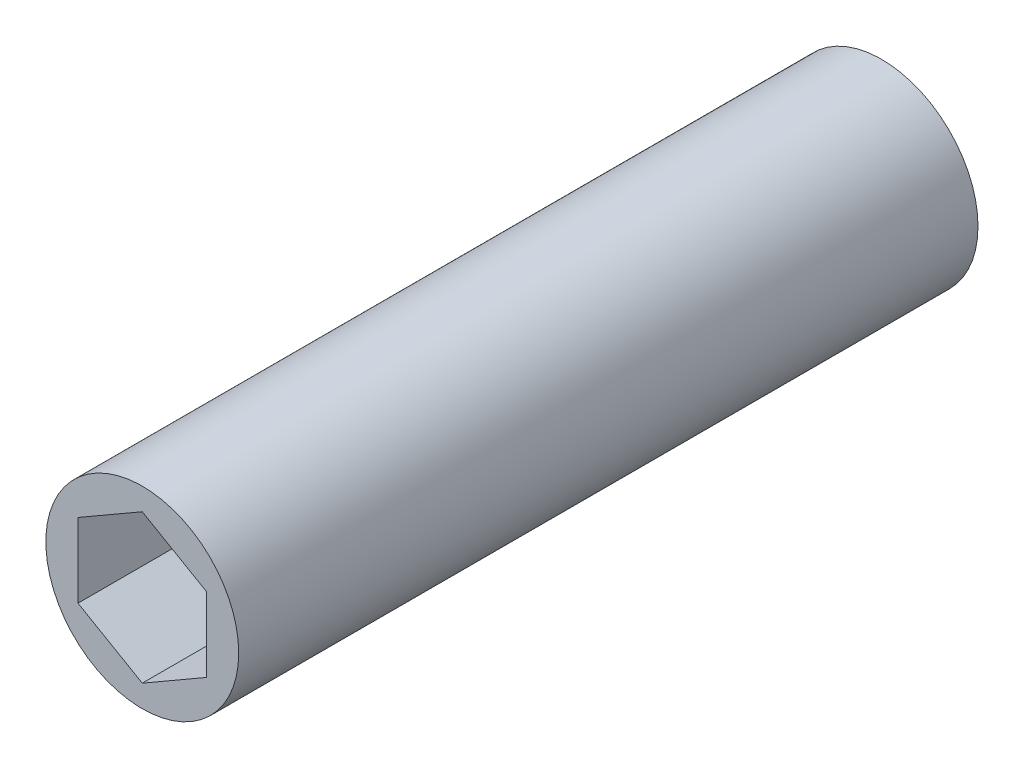
ISO-10303-21;
HEADER;
FILE_DESCRIPTION(('STEP AP214'),'2;1');
FILE_NAME('part.step','',(''),(''),'','','');
FILE_SCHEMA(('AUTOMOTIVE_DESIGN { 1 0 10303 214 1 1 1 1 }'));
ENDSEC;
DATA;
#1=APPLICATION_CONTEXT('core data for automotive mechanical design processes');
#2=APPLICATION_PROTOCOL_DEFINITION('international standard','automotive_design',2000,#1);
#3=PRODUCT_CONTEXT('',#1,'mechanical');
#4=PRODUCT('Part','Part','',(#3));
#5=PRODUCT_RELATED_PRODUCT_CATEGORY('part','',(#4));
#6=PRODUCT_DEFINITION_FORMATION('','',#4);
#7=PRODUCT_DEFINITION_CONTEXT('part definition',#1,'design');
#8=PRODUCT_DEFINITION('design','',#6,#7);
#9=PRODUCT_DEFINITION_SHAPE('','',#8);
#10=(LENGTH_UNIT() NAMED_UNIT(*) SI_UNIT(.MILLI.,.METRE.));
#11=(NAMED_UNIT(*) PLANE_ANGLE_UNIT() SI_UNIT($,.RADIAN.));
#12=(NAMED_UNIT(*) SI_UNIT($,.STERADIAN.) SOLID_ANGLE_UNIT());
#13=UNCERTAINTY_MEASURE_WITH_UNIT(LENGTH_MEASURE(1.E-05),#10,'distance_accuracy_value','');
#14=(GEOMETRIC_REPRESENTATION_CONTEXT(3) GLOBAL_UNCERTAINTY_ASSIGNED_CONTEXT((#13)) GLOBAL_UNIT_ASSIGNED_CONTEXT((#10,
#11,#12)) REPRESENTATION_CONTEXT('',''));
#15=CARTESIAN_POINT('',(0.,0.,0.));
#16=DIRECTION('',(0.,0.,1.));
#17=DIRECTION('',(1.,0.,0.));
#18=AXIS2_PLACEMENT_3D('',#15,#16,#17);
#19=CARTESIAN_POINT('',(114.3,627.126,-73.025));
#20=DIRECTION('',(0.,0.,1.));
#21=DIRECTION('',(1.,0.,0.));
#22=AXIS2_PLACEMENT_3D('',#19,#20,#21);
#23=CYLINDRICAL_SURFACE('',#22,9.525);
#24=CARTESIAN_POINT('',(114.3,627.126,-73.025));
#25=DIRECTION('',(0.,0.,1.));
#26=DIRECTION('',(1.,0.,0.));
#27=AXIS2_PLACEMENT_3D('',#24,#25,#26);
#28=CIRCLE('',#27,9.525);
#29=CARTESIAN_POINT('',(123.825,627.126,-73.025));
#30=VERTEX_POINT('',#29);
#31=EDGE_CURVE('E11',#30,#30,#28,.T.);
#32=ORIENTED_EDGE('',*,*,#31,.T.);
#33=EDGE_LOOP('',(#32));
#34=FACE_BOUND('',#33,.T.);
#35=CARTESIAN_POINT('',(114.3,627.126,0.));
#36=DIRECTION('',(0.,0.,1.));
#37=DIRECTION('',(1.,0.,0.));
#38=AXIS2_PLACEMENT_3D('',#35,#36,#37);
#39=CIRCLE('',#38,9.525);
#40=CARTESIAN_POINT('',(123.825,627.126,0.));
#41=VERTEX_POINT('',#40);
#42=EDGE_CURVE('E48',#41,#41,#39,.T.);
#43=ORIENTED_EDGE('',*,*,#42,.F.);
#44=EDGE_LOOP('',(#43));
#45=FACE_BOUND('',#44,.T.);
#46=ADVANCED_FACE('F45',(#34,#45),#23,.T.);
#47=CARTESIAN_POINT('',(114.3,627.126,-73.025));
#48=DIRECTION('',(0.,0.,1.));
#49=DIRECTION('',(1.,0.,0.));
#50=AXIS2_PLACEMENT_3D('',#47,#48,#49);
#51=PLANE('',#50);
#52=DIRECTION('',(0.,1.,0.));
#53=VECTOR('',#52,1.);
#54=CARTESIAN_POINT('',(120.65,623.459825790646,-73.025));
#55=LINE('',#54,#53);
#56=CARTESIAN_POINT('',(120.65,623.459825790646,-73.025));
#57=VERTEX_POINT('',#56);
#58=CARTESIAN_POINT('',(120.65,630.792174209354,-73.025));
#59=VERTEX_POINT('',#58);
#60=EDGE_CURVE('E107',#57,#59,#55,.T.);
#61=ORIENTED_EDGE('',*,*,#60,.T.);
#62=DIRECTION('',(-0.866025403784438,0.500000000000001,0.));
#63=VECTOR('',#62,1.);
#64=CARTESIAN_POINT('',(120.65,630.792174209354,-73.025));
#65=LINE('',#64,#63);
#66=CARTESIAN_POINT('',(114.3,634.458348418708,-73.025));
#67=VERTEX_POINT('',#66);
#68=EDGE_CURVE('E100',#59,#67,#65,.T.);
#69=ORIENTED_EDGE('',*,*,#68,.T.);
#70=DIRECTION('',(-0.866025403784436,-0.500000000000005,0.));
#71=VECTOR('',#70,1.);
#72=CARTESIAN_POINT('',(114.3,634.458348418708,-73.025));
#73=LINE('',#72,#71);
#74=CARTESIAN_POINT('',(107.95,630.792174209354,-73.025));
#75=VERTEX_POINT('',#74);
#76=EDGE_CURVE('E110',#67,#75,#73,.T.);
#77=ORIENTED_EDGE('',*,*,#76,.T.);
#78=DIRECTION('',(0.,-1.,0.));
#79=VECTOR('',#78,1.);
#80=CARTESIAN_POINT('',(107.95,630.792174209354,-73.025));
#81=LINE('',#80,#79);
#82=CARTESIAN_POINT('',(107.95,623.459825790646,-73.025));
#83=VERTEX_POINT('',#82);
#84=EDGE_CURVE('E60',#75,#83,#81,.T.);
#85=ORIENTED_EDGE('',*,*,#84,.T.);
#86=DIRECTION('',(0.866025403784437,-0.500000000000002,0.));
#87=VECTOR('',#86,1.);
#88=CARTESIAN_POINT('',(107.95,623.459825790646,-73.025));
#89=LINE('',#88,#87);
#90=CARTESIAN_POINT('',(114.3,619.793651581292,-73.025));
#91=VERTEX_POINT('',#90);
#92=EDGE_CURVE('E129',#83,#91,#89,.T.);
#93=ORIENTED_EDGE('',*,*,#92,.T.);
#94=DIRECTION('',(0.866025403784436,0.500000000000004,0.));
#95=VECTOR('',#94,1.);
#96=CARTESIAN_POINT('',(114.3,619.793651581292,-73.025));
#97=LINE('',#96,#95);
#98=EDGE_CURVE('E133',#91,#57,#97,.T.);
#99=ORIENTED_EDGE('',*,*,#98,.T.);
#100=EDGE_LOOP('',(#61,#69,#77,#85,#93,#99));
#101=FACE_BOUND('',#100,.T.);
#102=ORIENTED_EDGE('',*,*,#31,.F.);
#103=EDGE_LOOP('',(#102));
#104=FACE_BOUND('',#103,.T.);
#105=ADVANCED_FACE('F115',(#101,#104),#51,.F.);
#106=CARTESIAN_POINT('',(114.3,627.126,0.));
#107=DIRECTION('',(0.,0.,1.));
#108=DIRECTION('',(1.,0.,0.));
#109=AXIS2_PLACEMENT_3D('',#106,#107,#108);
#110=PLANE('',#109);
#111=DIRECTION('',(-0.866025403784438,0.500000000000001,0.));
#112=VECTOR('',#111,1.);
#113=CARTESIAN_POINT('',(120.65,630.792174209354,0.));
#114=LINE('',#113,#112);
#115=CARTESIAN_POINT('',(120.65,630.792174209354,0.));
#116=VERTEX_POINT('',#115);
#117=CARTESIAN_POINT('',(114.3,634.458348418708,0.));
#118=VERTEX_POINT('',#117);
#119=EDGE_CURVE('E68',#116,#118,#114,.T.);
#120=ORIENTED_EDGE('',*,*,#119,.F.);
#121=DIRECTION('',(0.,1.,0.));
#122=VECTOR('',#121,1.);
#123=CARTESIAN_POINT('',(120.65,623.459825790646,0.));
#124=LINE('',#123,#122);
#125=CARTESIAN_POINT('',(120.65,623.459825790646,0.));
#126=VERTEX_POINT('',#125);
#127=EDGE_CURVE('E120',#126,#116,#124,.T.);
#128=ORIENTED_EDGE('',*,*,#127,.F.);
#129=DIRECTION('',(0.866025403784436,0.500000000000004,0.));
#130=VECTOR('',#129,1.);
#131=CARTESIAN_POINT('',(114.3,619.793651581292,0.));
#132=LINE('',#131,#130);
#133=CARTESIAN_POINT('',(114.3,619.793651581292,0.));
#134=VERTEX_POINT('',#133);
#135=EDGE_CURVE('E124',#134,#126,#132,.T.);
#136=ORIENTED_EDGE('',*,*,#135,.F.);
#137=DIRECTION('',(0.866025403784437,-0.500000000000002,0.));
#138=VECTOR('',#137,1.);
#139=CARTESIAN_POINT('',(107.95,623.459825790646,0.));
#140=LINE('',#139,#138);
#141=CARTESIAN_POINT('',(107.95,623.459825790646,0.));
#142=VERTEX_POINT('',#141);
#143=EDGE_CURVE('E147',#142,#134,#140,.T.);
#144=ORIENTED_EDGE('',*,*,#143,.F.);
#145=DIRECTION('',(0.,-1.,0.));
#146=VECTOR('',#145,1.);
#147=CARTESIAN_POINT('',(107.95,630.792174209354,0.));
#148=LINE('',#147,#146);
#149=CARTESIAN_POINT('',(107.95,630.792174209354,0.));
#150=VERTEX_POINT('',#149);
#151=EDGE_CURVE('E143',#150,#142,#148,.T.);
#152=ORIENTED_EDGE('',*,*,#151,.F.);
#153=DIRECTION('',(-0.866025403784436,-0.500000000000005,0.));
#154=VECTOR('',#153,1.);
#155=CARTESIAN_POINT('',(114.3,634.458348418708,0.));
#156=LINE('',#155,#154);
#157=EDGE_CURVE('E140',#118,#150,#156,.T.);
#158=ORIENTED_EDGE('',*,*,#157,.F.);
#159=EDGE_LOOP('',(#120,#128,#136,#144,#152,#158));
#160=FACE_BOUND('',#159,.T.);
#161=ORIENTED_EDGE('',*,*,#42,.T.);
#162=EDGE_LOOP('',(#161));
#163=FACE_BOUND('',#162,.T.);
#164=ADVANCED_FACE('F171',(#160,#163),#110,.T.);
#165=CARTESIAN_POINT('',(120.65,630.792174209354,-73.025));
#166=DIRECTION('',(0.500000000000001,0.866025403784438,0.));
#167=DIRECTION('',(-0.866025403784438,0.500000000000001,0.));
#168=AXIS2_PLACEMENT_3D('',#165,#166,#167);
#169=PLANE('',#168);
#170=ORIENTED_EDGE('',*,*,#119,.T.);
#171=DIRECTION('',(0.,0.,1.));
#172=VECTOR('',#171,1.);
#173=CARTESIAN_POINT('',(114.3,634.458348418708,-73.025));
#174=LINE('',#173,#172);
#175=EDGE_CURVE('E96',#67,#118,#174,.T.);
#176=ORIENTED_EDGE('',*,*,#175,.F.);
#177=ORIENTED_EDGE('',*,*,#68,.F.);
#178=DIRECTION('',(0.,0.,1.));
#179=VECTOR('',#178,1.);
#180=CARTESIAN_POINT('',(120.65,630.792174209354,-73.025));
#181=LINE('',#180,#179);
#182=EDGE_CURVE('E154',#59,#116,#181,.T.);
#183=ORIENTED_EDGE('',*,*,#182,.T.);
#184=EDGE_LOOP('',(#170,#176,#177,#183));
#185=FACE_BOUND('',#184,.T.);
#186=ADVANCED_FACE('F98',(#185),#169,.F.);
#187=CARTESIAN_POINT('',(120.65,623.459825790646,-73.025));
#188=DIRECTION('',(1.,0.,0.));
#189=DIRECTION('',(0.,0.,-1.));
#190=AXIS2_PLACEMENT_3D('',#187,#188,#189);
#191=PLANE('',#190);
#192=ORIENTED_EDGE('',*,*,#127,.T.);
#193=ORIENTED_EDGE('',*,*,#182,.F.);
#194=ORIENTED_EDGE('',*,*,#60,.F.);
#195=DIRECTION('',(0.,0.,1.));
#196=VECTOR('',#195,1.);
#197=CARTESIAN_POINT('',(120.65,623.459825790646,-73.025));
#198=LINE('',#197,#196);
#199=EDGE_CURVE('E157',#57,#126,#198,.T.);
#200=ORIENTED_EDGE('',*,*,#199,.T.);
#201=EDGE_LOOP('',(#192,#193,#194,#200));
#202=FACE_BOUND('',#201,.T.);
#203=ADVANCED_FACE('F182',(#202),#191,.F.);
#204=CARTESIAN_POINT('',(114.3,619.793651581292,-73.025));
#205=DIRECTION('',(0.500000000000004,-0.866025403784436,0.));
#206=DIRECTION('',(0.866025403784436,0.500000000000004,0.));
#207=AXIS2_PLACEMENT_3D('',#204,#205,#206);
#208=PLANE('',#207);
#209=ORIENTED_EDGE('',*,*,#135,.T.);
#210=ORIENTED_EDGE('',*,*,#199,.F.);
#211=ORIENTED_EDGE('',*,*,#98,.F.);
#212=DIRECTION('',(0.,0.,1.));
#213=VECTOR('',#212,1.);
#214=CARTESIAN_POINT('',(114.3,619.793651581292,-73.025));
#215=LINE('',#214,#213);
#216=EDGE_CURVE('E160',#91,#134,#215,.T.);
#217=ORIENTED_EDGE('',*,*,#216,.T.);
#218=EDGE_LOOP('',(#209,#210,#211,#217));
#219=FACE_BOUND('',#218,.T.);
#220=ADVANCED_FACE('F180',(#219),#208,.F.);
#221=CARTESIAN_POINT('',(107.95,623.459825790646,-73.025));
#222=DIRECTION('',(-0.500000000000002,-0.866025403784437,0.));
#223=DIRECTION('',(0.866025403784437,-0.500000000000002,0.));
#224=AXIS2_PLACEMENT_3D('',#221,#222,#223);
#225=PLANE('',#224);
#226=ORIENTED_EDGE('',*,*,#143,.T.);
#227=ORIENTED_EDGE('',*,*,#216,.F.);
#228=ORIENTED_EDGE('',*,*,#92,.F.);
#229=DIRECTION('',(0.,0.,1.));
#230=VECTOR('',#229,1.);
#231=CARTESIAN_POINT('',(107.95,623.459825790646,-73.025));
#232=LINE('',#231,#230);
#233=EDGE_CURVE('E163',#83,#142,#232,.T.);
#234=ORIENTED_EDGE('',*,*,#233,.T.);
#235=EDGE_LOOP('',(#226,#227,#228,#234));
#236=FACE_BOUND('',#235,.T.);
#237=ADVANCED_FACE('F176',(#236),#225,.F.);
#238=CARTESIAN_POINT('',(107.95,630.792174209354,-73.025));
#239=DIRECTION('',(-1.,0.,0.));
#240=DIRECTION('',(0.,0.,1.));
#241=AXIS2_PLACEMENT_3D('',#238,#239,#240);
#242=PLANE('',#241);
#243=ORIENTED_EDGE('',*,*,#151,.T.);
#244=ORIENTED_EDGE('',*,*,#233,.F.);
#245=ORIENTED_EDGE('',*,*,#84,.F.);
#246=DIRECTION('',(0.,0.,1.));
#247=VECTOR('',#246,1.);
#248=CARTESIAN_POINT('',(107.95,630.792174209354,-73.025));
#249=LINE('',#248,#247);
#250=EDGE_CURVE('E106',#75,#150,#249,.T.);
#251=ORIENTED_EDGE('',*,*,#250,.T.);
#252=EDGE_LOOP('',(#243,#244,#245,#251));
#253=FACE_BOUND('',#252,.T.);
#254=ADVANCED_FACE('F167',(#253),#242,.F.);
#255=CARTESIAN_POINT('',(114.3,634.458348418708,-73.025));
#256=DIRECTION('',(-0.500000000000005,0.866025403784436,0.));
#257=DIRECTION('',(-0.866025403784436,-0.500000000000005,0.));
#258=AXIS2_PLACEMENT_3D('',#255,#256,#257);
#259=PLANE('',#258);
#260=ORIENTED_EDGE('',*,*,#157,.T.);
#261=ORIENTED_EDGE('',*,*,#250,.F.);
#262=ORIENTED_EDGE('',*,*,#76,.F.);
#263=ORIENTED_EDGE('',*,*,#175,.T.);
#264=EDGE_LOOP('',(#260,#261,#262,#263));
#265=FACE_BOUND('',#264,.T.);
#266=ADVANCED_FACE('F111',(#265),#259,.F.);
#267=CLOSED_SHELL('',(#46,#105,#164,#186,#203,#220,#237,#254,#266));
#268=MANIFOLD_SOLID_BREP('B2',#267);
#269=ADVANCED_BREP_SHAPE_REPRESENTATION('',(#18,#268),#14);
#270=SHAPE_DEFINITION_REPRESENTATION(#9,#269);
ENDSEC;
END-ISO-10303-21;
